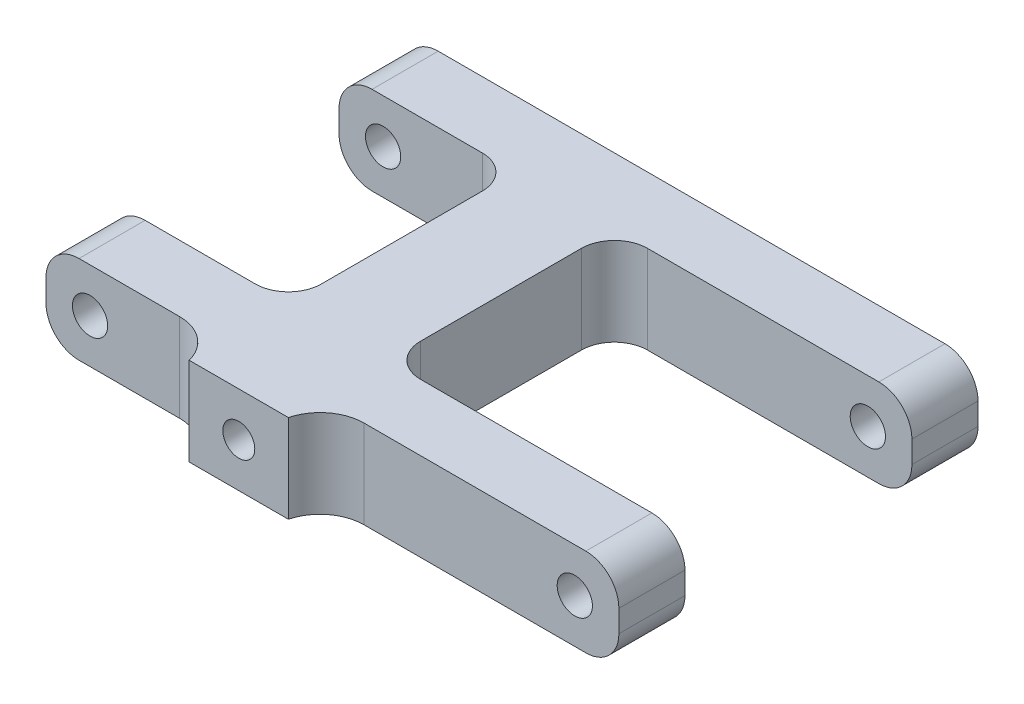
ISO-10303-21;
HEADER;
FILE_DESCRIPTION(('STEP AP214'),'2;1');
FILE_NAME('part.step','',(''),(''),'','','');
FILE_SCHEMA(('AUTOMOTIVE_DESIGN { 1 0 10303 214 1 1 1 1 }'));
ENDSEC;
DATA;
#1=APPLICATION_CONTEXT('core data for automotive mechanical design processes');
#2=APPLICATION_PROTOCOL_DEFINITION('international standard','automotive_design',2000,#1);
#3=PRODUCT_CONTEXT('',#1,'mechanical');
#4=PRODUCT('Part','Part','',(#3));
#5=PRODUCT_RELATED_PRODUCT_CATEGORY('part','',(#4));
#6=PRODUCT_DEFINITION_FORMATION('','',#4);
#7=PRODUCT_DEFINITION_CONTEXT('part definition',#1,'design');
#8=PRODUCT_DEFINITION('design','',#6,#7);
#9=PRODUCT_DEFINITION_SHAPE('','',#8);
#10=(LENGTH_UNIT() NAMED_UNIT(*) SI_UNIT(.MILLI.,.METRE.));
#11=(NAMED_UNIT(*) PLANE_ANGLE_UNIT() SI_UNIT($,.RADIAN.));
#12=(NAMED_UNIT(*) SI_UNIT($,.STERADIAN.) SOLID_ANGLE_UNIT());
#13=UNCERTAINTY_MEASURE_WITH_UNIT(LENGTH_MEASURE(1.E-05),#10,'distance_accuracy_value','');
#14=(GEOMETRIC_REPRESENTATION_CONTEXT(3) GLOBAL_UNCERTAINTY_ASSIGNED_CONTEXT((#13)) GLOBAL_UNIT_ASSIGNED_CONTEXT((#10,
#11,#12)) REPRESENTATION_CONTEXT('',''));
#15=CARTESIAN_POINT('',(0.,0.,0.));
#16=DIRECTION('',(0.,0.,1.));
#17=DIRECTION('',(1.,0.,0.));
#18=AXIS2_PLACEMENT_3D('',#15,#16,#17);
#19=CARTESIAN_POINT('',(0.,8.,32.6));
#20=DIRECTION('',(0.,0.,-1.));
#21=DIRECTION('',(-1.,0.,0.));
#22=AXIS2_PLACEMENT_3D('',#19,#20,#21);
#23=PLANE('',#22);
#24=CARTESIAN_POINT('',(4.,4.,32.6));
#25=DIRECTION('',(0.,0.,1.));
#26=DIRECTION('',(1.,0.,0.));
#27=AXIS2_PLACEMENT_3D('',#24,#25,#26);
#28=CIRCLE('',#27,1.6);
#29=CARTESIAN_POINT('',(5.6,4.,32.6));
#30=VERTEX_POINT('',#29);
#31=EDGE_CURVE('E254',#30,#30,#28,.T.);
#32=ORIENTED_EDGE('',*,*,#31,.F.);
#33=EDGE_LOOP('',(#32));
#34=FACE_BOUND('',#33,.T.);
#35=DIRECTION('',(1.,0.,0.));
#36=VECTOR('',#35,1.);
#37=CARTESIAN_POINT('',(0.,0.,32.6));
#38=LINE('',#37,#36);
#39=CARTESIAN_POINT('',(3.,0.,32.6));
#40=VERTEX_POINT('',#39);
#41=CARTESIAN_POINT('',(12.1270166537926,0.,32.6));
#42=VERTEX_POINT('',#41);
#43=EDGE_CURVE('E312',#40,#42,#38,.T.);
#44=ORIENTED_EDGE('',*,*,#43,.T.);
#45=DIRECTION('',(0.,-1.,0.));
#46=VECTOR('',#45,1.);
#47=CARTESIAN_POINT('',(12.1270166537926,8.,32.6));
#48=LINE('',#47,#46);
#49=CARTESIAN_POINT('',(12.1270166537926,8.,32.6));
#50=VERTEX_POINT('',#49);
#51=EDGE_CURVE('E54',#42,#50,#48,.F.);
#52=ORIENTED_EDGE('',*,*,#51,.T.);
#53=DIRECTION('',(1.,0.,0.));
#54=VECTOR('',#53,1.);
#55=CARTESIAN_POINT('',(0.,8.,32.6));
#56=LINE('',#55,#54);
#57=CARTESIAN_POINT('',(3.,8.,32.6));
#58=VERTEX_POINT('',#57);
#59=EDGE_CURVE('E305',#58,#50,#56,.T.);
#60=ORIENTED_EDGE('',*,*,#59,.F.);
#61=CARTESIAN_POINT('',(3.,5.,32.6));
#62=DIRECTION('',(0.,0.,-1.));
#63=DIRECTION('',(-1.,0.,0.));
#64=AXIS2_PLACEMENT_3D('',#61,#62,#63);
#65=CIRCLE('',#64,3.);
#66=CARTESIAN_POINT('',(0.,5.,32.6));
#67=VERTEX_POINT('',#66);
#68=EDGE_CURVE('E342',#58,#67,#65,.F.);
#69=ORIENTED_EDGE('',*,*,#68,.T.);
#70=DIRECTION('',(0.,-1.,0.));
#71=VECTOR('',#70,1.);
#72=CARTESIAN_POINT('',(0.,8.,32.6));
#73=LINE('',#72,#71);
#74=CARTESIAN_POINT('',(0.,3.,32.6));
#75=VERTEX_POINT('',#74);
#76=EDGE_CURVE('E325',#67,#75,#73,.T.);
#77=ORIENTED_EDGE('',*,*,#76,.T.);
#78=CARTESIAN_POINT('',(3.,3.,32.6));
#79=DIRECTION('',(0.,0.,-1.));
#80=DIRECTION('',(-1.,0.,0.));
#81=AXIS2_PLACEMENT_3D('',#78,#79,#80);
#82=CIRCLE('',#81,3.);
#83=EDGE_CURVE('E344',#75,#40,#82,.F.);
#84=ORIENTED_EDGE('',*,*,#83,.T.);
#85=EDGE_LOOP('',(#44,#52,#60,#69,#77,#84));
#86=FACE_BOUND('',#85,.T.);
#87=ADVANCED_FACE('F33',(#34,#86),#23,.F.);
#88=CARTESIAN_POINT('',(48.,4.,32.6));
#89=DIRECTION('',(0.,0.,1.));
#90=DIRECTION('',(1.,0.,0.));
#91=AXIS2_PLACEMENT_3D('',#88,#89,#90);
#92=CIRCLE('',#91,1.59999999999999);
#93=CARTESIAN_POINT('',(49.6,4.,32.6));
#94=VERTEX_POINT('',#93);
#95=EDGE_CURVE('E244',#94,#94,#92,.T.);
#96=ORIENTED_EDGE('',*,*,#95,.F.);
#97=EDGE_LOOP('',(#96));
#98=FACE_BOUND('',#97,.T.);
#99=CARTESIAN_POINT('',(28.8729833462074,8.,32.6));
#100=VERTEX_POINT('',#99);
#101=CARTESIAN_POINT('',(49.,8.,32.6));
#102=VERTEX_POINT('',#101);
#103=EDGE_CURVE('E308',#100,#102,#56,.T.);
#104=ORIENTED_EDGE('',*,*,#103,.F.);
#105=DIRECTION('',(0.,1.,0.));
#106=VECTOR('',#105,1.);
#107=CARTESIAN_POINT('',(28.8729833462074,8.,32.6));
#108=LINE('',#107,#106);
#109=CARTESIAN_POINT('',(28.8729833462074,0.,32.6));
#110=VERTEX_POINT('',#109);
#111=EDGE_CURVE('E447',#100,#110,#108,.F.);
#112=ORIENTED_EDGE('',*,*,#111,.T.);
#113=CARTESIAN_POINT('',(49.,0.,32.6));
#114=VERTEX_POINT('',#113);
#115=EDGE_CURVE('E299',#110,#114,#38,.T.);
#116=ORIENTED_EDGE('',*,*,#115,.T.);
#117=CARTESIAN_POINT('',(49.,3.,32.6));
#118=DIRECTION('',(0.,0.,-1.));
#119=DIRECTION('',(-1.,0.,0.));
#120=AXIS2_PLACEMENT_3D('',#117,#118,#119);
#121=CIRCLE('',#120,3.);
#122=CARTESIAN_POINT('',(52.,3.,32.6));
#123=VERTEX_POINT('',#122);
#124=EDGE_CURVE('E340',#114,#123,#121,.F.);
#125=ORIENTED_EDGE('',*,*,#124,.T.);
#126=DIRECTION('',(0.,-1.,0.));
#127=VECTOR('',#126,1.);
#128=CARTESIAN_POINT('',(52.,8.,32.6));
#129=LINE('',#128,#127);
#130=CARTESIAN_POINT('',(52.,5.,32.6));
#131=VERTEX_POINT('',#130);
#132=EDGE_CURVE('E322',#131,#123,#129,.T.);
#133=ORIENTED_EDGE('',*,*,#132,.F.);
#134=CARTESIAN_POINT('',(49.,5.,32.6));
#135=DIRECTION('',(0.,0.,-1.));
#136=DIRECTION('',(-1.,0.,0.));
#137=AXIS2_PLACEMENT_3D('',#134,#135,#136);
#138=CIRCLE('',#137,3.);
#139=EDGE_CURVE('E337',#131,#102,#138,.F.);
#140=ORIENTED_EDGE('',*,*,#139,.T.);
#141=EDGE_LOOP('',(#104,#112,#116,#125,#133,#140));
#142=FACE_BOUND('',#141,.T.);
#143=ADVANCED_FACE('F460',(#98,#142),#23,.F.);
#144=CARTESIAN_POINT('',(0.,8.,0.));
#145=DIRECTION('',(1.,0.,0.));
#146=DIRECTION('',(0.,0.,-1.));
#147=AXIS2_PLACEMENT_3D('',#144,#145,#146);
#148=PLANE('',#147);
#149=DIRECTION('',(0.,-1.,0.));
#150=VECTOR('',#149,1.);
#151=CARTESIAN_POINT('',(0.,8.,0.));
#152=LINE('',#151,#150);
#153=CARTESIAN_POINT('',(0.,5.,0.));
#154=VERTEX_POINT('',#153);
#155=CARTESIAN_POINT('',(0.,3.,0.));
#156=VERTEX_POINT('',#155);
#157=EDGE_CURVE('E311',#154,#156,#152,.T.);
#158=ORIENTED_EDGE('',*,*,#157,.T.);
#159=DIRECTION('',(0.,0.,1.));
#160=VECTOR('',#159,1.);
#161=CARTESIAN_POINT('',(0.,3.,0.));
#162=LINE('',#161,#160);
#163=CARTESIAN_POINT('',(0.,3.,6.));
#164=VERTEX_POINT('',#163);
#165=EDGE_CURVE('E376',#156,#164,#162,.T.);
#166=ORIENTED_EDGE('',*,*,#165,.T.);
#167=DIRECTION('',(0.,-1.,0.));
#168=VECTOR('',#167,1.);
#169=CARTESIAN_POINT('',(0.,8.,6.));
#170=LINE('',#169,#168);
#171=CARTESIAN_POINT('',(0.,5.,6.));
#172=VERTEX_POINT('',#171);
#173=EDGE_CURVE('E264',#172,#164,#170,.T.);
#174=ORIENTED_EDGE('',*,*,#173,.F.);
#175=DIRECTION('',(0.,0.,1.));
#176=VECTOR('',#175,1.);
#177=CARTESIAN_POINT('',(0.,5.,0.));
#178=LINE('',#177,#176);
#179=EDGE_CURVE('E374',#172,#154,#178,.F.);
#180=ORIENTED_EDGE('',*,*,#179,.T.);
#181=EDGE_LOOP('',(#158,#166,#174,#180));
#182=FACE_BOUND('',#181,.T.);
#183=ADVANCED_FACE('F481',(#182),#148,.F.);
#184=CARTESIAN_POINT('',(52.,8.,0.));
#185=DIRECTION('',(-1.,0.,0.));
#186=DIRECTION('',(0.,0.,1.));
#187=AXIS2_PLACEMENT_3D('',#184,#185,#186);
#188=PLANE('',#187);
#189=ORIENTED_EDGE('',*,*,#132,.T.);
#190=DIRECTION('',(0.,0.,-1.));
#191=VECTOR('',#190,1.);
#192=CARTESIAN_POINT('',(52.,3.,0.));
#193=LINE('',#192,#191);
#194=CARTESIAN_POINT('',(52.,3.,26.6));
#195=VERTEX_POINT('',#194);
#196=EDGE_CURVE('E404',#123,#195,#193,.T.);
#197=ORIENTED_EDGE('',*,*,#196,.T.);
#198=DIRECTION('',(0.,-1.,0.));
#199=VECTOR('',#198,1.);
#200=CARTESIAN_POINT('',(52.,8.,26.6));
#201=LINE('',#200,#199);
#202=CARTESIAN_POINT('',(52.,5.,26.6));
#203=VERTEX_POINT('',#202);
#204=EDGE_CURVE('E279',#203,#195,#201,.T.);
#205=ORIENTED_EDGE('',*,*,#204,.F.);
#206=DIRECTION('',(0.,0.,-1.));
#207=VECTOR('',#206,1.);
#208=CARTESIAN_POINT('',(52.,5.,32.6));
#209=LINE('',#208,#207);
#210=EDGE_CURVE('E402',#203,#131,#209,.F.);
#211=ORIENTED_EDGE('',*,*,#210,.T.);
#212=EDGE_LOOP('',(#189,#197,#205,#211));
#213=FACE_BOUND('',#212,.T.);
#214=ADVANCED_FACE('F491',(#213),#188,.F.);
#215=DIRECTION('',(0.,1.,0.));
#216=VECTOR('',#215,1.);
#217=CARTESIAN_POINT('',(0.,8.,26.6));
#218=LINE('',#217,#216);
#219=CARTESIAN_POINT('',(0.,3.,26.6));
#220=VERTEX_POINT('',#219);
#221=CARTESIAN_POINT('',(0.,5.,26.6));
#222=VERTEX_POINT('',#221);
#223=EDGE_CURVE('E269',#220,#222,#218,.T.);
#224=ORIENTED_EDGE('',*,*,#223,.F.);
#225=DIRECTION('',(0.,0.,1.));
#226=VECTOR('',#225,1.);
#227=CARTESIAN_POINT('',(0.,3.,0.));
#228=LINE('',#227,#226);
#229=EDGE_CURVE('E334',#220,#75,#228,.T.);
#230=ORIENTED_EDGE('',*,*,#229,.T.);
#231=ORIENTED_EDGE('',*,*,#76,.F.);
#232=DIRECTION('',(0.,0.,1.));
#233=VECTOR('',#232,1.);
#234=CARTESIAN_POINT('',(0.,5.,26.6));
#235=LINE('',#234,#233);
#236=EDGE_CURVE('E328',#67,#222,#235,.F.);
#237=ORIENTED_EDGE('',*,*,#236,.T.);
#238=EDGE_LOOP('',(#224,#230,#231,#237));
#239=FACE_BOUND('',#238,.T.);
#240=ADVANCED_FACE('F488',(#239),#148,.F.);
#241=DIRECTION('',(0.,-1.,0.));
#242=VECTOR('',#241,1.);
#243=CARTESIAN_POINT('',(52.,8.,0.));
#244=LINE('',#243,#242);
#245=CARTESIAN_POINT('',(52.,5.,0.));
#246=VERTEX_POINT('',#245);
#247=CARTESIAN_POINT('',(52.,3.,0.));
#248=VERTEX_POINT('',#247);
#249=EDGE_CURVE('E319',#246,#248,#244,.T.);
#250=ORIENTED_EDGE('',*,*,#249,.F.);
#251=DIRECTION('',(0.,0.,-1.));
#252=VECTOR('',#251,1.);
#253=CARTESIAN_POINT('',(52.,5.,5.99999999999999));
#254=LINE('',#253,#252);
#255=CARTESIAN_POINT('',(52.,5.,5.99999999999999));
#256=VERTEX_POINT('',#255);
#257=EDGE_CURVE('E395',#246,#256,#254,.F.);
#258=ORIENTED_EDGE('',*,*,#257,.T.);
#259=DIRECTION('',(0.,1.,0.));
#260=VECTOR('',#259,1.);
#261=CARTESIAN_POINT('',(52.,8.,5.99999999999999));
#262=LINE('',#261,#260);
#263=CARTESIAN_POINT('',(52.,3.,5.99999999999999));
#264=VERTEX_POINT('',#263);
#265=EDGE_CURVE('E289',#264,#256,#262,.T.);
#266=ORIENTED_EDGE('',*,*,#265,.F.);
#267=DIRECTION('',(0.,0.,-1.));
#268=VECTOR('',#267,1.);
#269=CARTESIAN_POINT('',(52.,3.,0.));
#270=LINE('',#269,#268);
#271=EDGE_CURVE('E392',#264,#248,#270,.T.);
#272=ORIENTED_EDGE('',*,*,#271,.T.);
#273=EDGE_LOOP('',(#250,#258,#266,#272));
#274=FACE_BOUND('',#273,.T.);
#275=ADVANCED_FACE('F486',(#274),#188,.F.);
#276=CARTESIAN_POINT('',(0.,8.,0.));
#277=DIRECTION('',(0.,0.,1.));
#278=DIRECTION('',(1.,0.,0.));
#279=AXIS2_PLACEMENT_3D('',#276,#277,#278);
#280=PLANE('',#279);
#281=CARTESIAN_POINT('',(48.,4.,0.));
#282=DIRECTION('',(0.,0.,1.));
#283=DIRECTION('',(1.,0.,0.));
#284=AXIS2_PLACEMENT_3D('',#281,#282,#283);
#285=CIRCLE('',#284,1.59999999999999);
#286=CARTESIAN_POINT('',(49.6,4.,0.));
#287=VERTEX_POINT('',#286);
#288=EDGE_CURVE('E245',#287,#287,#285,.T.);
#289=ORIENTED_EDGE('',*,*,#288,.T.);
#290=EDGE_LOOP('',(#289));
#291=FACE_BOUND('',#290,.T.);
#292=CARTESIAN_POINT('',(4.,4.,0.));
#293=DIRECTION('',(0.,0.,1.));
#294=DIRECTION('',(1.,0.,0.));
#295=AXIS2_PLACEMENT_3D('',#292,#293,#294);
#296=CIRCLE('',#295,1.6);
#297=CARTESIAN_POINT('',(5.6,4.,0.));
#298=VERTEX_POINT('',#297);
#299=EDGE_CURVE('E255',#298,#298,#296,.T.);
#300=ORIENTED_EDGE('',*,*,#299,.T.);
#301=EDGE_LOOP('',(#300));
#302=FACE_BOUND('',#301,.T.);
#303=DIRECTION('',(-1.,0.,0.));
#304=VECTOR('',#303,1.);
#305=CARTESIAN_POINT('',(0.,0.,0.));
#306=LINE('',#305,#304);
#307=CARTESIAN_POINT('',(49.,0.,0.));
#308=VERTEX_POINT('',#307);
#309=CARTESIAN_POINT('',(3.,0.,0.));
#310=VERTEX_POINT('',#309);
#311=EDGE_CURVE('E314',#308,#310,#306,.T.);
#312=ORIENTED_EDGE('',*,*,#311,.T.);
#313=CARTESIAN_POINT('',(3.,3.,0.));
#314=DIRECTION('',(0.,0.,1.));
#315=DIRECTION('',(1.,0.,0.));
#316=AXIS2_PLACEMENT_3D('',#313,#314,#315);
#317=CIRCLE('',#316,3.);
#318=EDGE_CURVE('E390',#310,#156,#317,.F.);
#319=ORIENTED_EDGE('',*,*,#318,.T.);
#320=ORIENTED_EDGE('',*,*,#157,.F.);
#321=CARTESIAN_POINT('',(3.,5.,0.));
#322=DIRECTION('',(0.,0.,1.));
#323=DIRECTION('',(1.,0.,0.));
#324=AXIS2_PLACEMENT_3D('',#321,#322,#323);
#325=CIRCLE('',#324,3.);
#326=CARTESIAN_POINT('',(3.,8.,0.));
#327=VERTEX_POINT('',#326);
#328=EDGE_CURVE('E388',#154,#327,#325,.F.);
#329=ORIENTED_EDGE('',*,*,#328,.T.);
#330=DIRECTION('',(-1.,0.,0.));
#331=VECTOR('',#330,1.);
#332=CARTESIAN_POINT('',(0.,8.,0.));
#333=LINE('',#332,#331);
#334=CARTESIAN_POINT('',(49.,8.,0.));
#335=VERTEX_POINT('',#334);
#336=EDGE_CURVE('E307',#335,#327,#333,.T.);
#337=ORIENTED_EDGE('',*,*,#336,.F.);
#338=CARTESIAN_POINT('',(49.,5.,0.));
#339=DIRECTION('',(0.,0.,1.));
#340=DIRECTION('',(1.,0.,0.));
#341=AXIS2_PLACEMENT_3D('',#338,#339,#340);
#342=CIRCLE('',#341,3.);
#343=EDGE_CURVE('E386',#335,#246,#342,.F.);
#344=ORIENTED_EDGE('',*,*,#343,.T.);
#345=ORIENTED_EDGE('',*,*,#249,.T.);
#346=CARTESIAN_POINT('',(49.,3.,0.));
#347=DIRECTION('',(0.,0.,1.));
#348=DIRECTION('',(1.,0.,0.));
#349=AXIS2_PLACEMENT_3D('',#346,#347,#348);
#350=CIRCLE('',#349,3.);
#351=EDGE_CURVE('E384',#248,#308,#350,.F.);
#352=ORIENTED_EDGE('',*,*,#351,.T.);
#353=EDGE_LOOP('',(#312,#319,#320,#329,#337,#344,#345,#352));
#354=FACE_BOUND('',#353,.T.);
#355=ADVANCED_FACE('F577',(#291,#302,#354),#280,.F.);
#356=CARTESIAN_POINT('',(0.,8.,0.));
#357=DIRECTION('',(0.,1.,0.));
#358=DIRECTION('',(0.,0.,1.));
#359=AXIS2_PLACEMENT_3D('',#356,#357,#358);
#360=PLANE('',#359);
#361=DIRECTION('',(0.,0.,-1.));
#362=VECTOR('',#361,1.);
#363=CARTESIAN_POINT('',(16.,8.,6.));
#364=LINE('',#363,#362);
#365=CARTESIAN_POINT('',(16.,8.,23.6));
#366=VERTEX_POINT('',#365);
#367=CARTESIAN_POINT('',(16.,8.,9.));
#368=VERTEX_POINT('',#367);
#369=EDGE_CURVE('E268',#366,#368,#364,.T.);
#370=ORIENTED_EDGE('',*,*,#369,.F.);
#371=CARTESIAN_POINT('',(13.,8.,23.6));
#372=DIRECTION('',(0.,1.,0.));
#373=DIRECTION('',(0.,0.,1.));
#374=AXIS2_PLACEMENT_3D('',#371,#372,#373);
#375=CIRCLE('',#374,3.);
#376=CARTESIAN_POINT('',(13.,8.,26.6));
#377=VERTEX_POINT('',#376);
#378=EDGE_CURVE('E440',#366,#377,#375,.F.);
#379=ORIENTED_EDGE('',*,*,#378,.T.);
#380=DIRECTION('',(-1.,0.,0.));
#381=VECTOR('',#380,1.);
#382=CARTESIAN_POINT('',(16.,8.,26.6));
#383=LINE('',#382,#381);
#384=CARTESIAN_POINT('',(3.,8.,26.6));
#385=VERTEX_POINT('',#384);
#386=EDGE_CURVE('E280',#377,#385,#383,.T.);
#387=ORIENTED_EDGE('',*,*,#386,.T.);
#388=DIRECTION('',(0.,0.,1.));
#389=VECTOR('',#388,1.);
#390=CARTESIAN_POINT('',(3.,8.,32.6));
#391=LINE('',#390,#389);
#392=EDGE_CURVE('E371',#385,#58,#391,.T.);
#393=ORIENTED_EDGE('',*,*,#392,.T.);
#394=ORIENTED_EDGE('',*,*,#59,.T.);
#395=CARTESIAN_POINT('',(12.1270166537926,8.,36.6));
#396=DIRECTION('',(0.,1.,0.));
#397=DIRECTION('',(0.,0.,1.));
#398=AXIS2_PLACEMENT_3D('',#395,#396,#397);
#399=CIRCLE('',#398,4.);
#400=CARTESIAN_POINT('',(16.,8.,35.6));
#401=VERTEX_POINT('',#400);
#402=EDGE_CURVE('E11',#50,#401,#399,.F.);
#403=ORIENTED_EDGE('',*,*,#402,.T.);
#404=DIRECTION('',(-1.,0.,0.));
#405=VECTOR('',#404,1.);
#406=CARTESIAN_POINT('',(16.,8.,35.6));
#407=LINE('',#406,#405);
#408=CARTESIAN_POINT('',(25.,8.,35.6));
#409=VERTEX_POINT('',#408);
#410=EDGE_CURVE('E234',#409,#401,#407,.T.);
#411=ORIENTED_EDGE('',*,*,#410,.F.);
#412=CARTESIAN_POINT('',(28.8729833462074,8.,36.6));
#413=DIRECTION('',(0.,1.,0.));
#414=DIRECTION('',(0.,0.,1.));
#415=AXIS2_PLACEMENT_3D('',#412,#413,#414);
#416=CIRCLE('',#415,4.);
#417=EDGE_CURVE('E451',#409,#100,#416,.F.);
#418=ORIENTED_EDGE('',*,*,#417,.T.);
#419=ORIENTED_EDGE('',*,*,#103,.T.);
#420=DIRECTION('',(0.,0.,-1.));
#421=VECTOR('',#420,1.);
#422=CARTESIAN_POINT('',(49.,8.,26.6));
#423=LINE('',#422,#421);
#424=CARTESIAN_POINT('',(49.,8.,26.6));
#425=VERTEX_POINT('',#424);
#426=EDGE_CURVE('E362',#102,#425,#423,.T.);
#427=ORIENTED_EDGE('',*,*,#426,.T.);
#428=DIRECTION('',(1.,0.,0.));
#429=VECTOR('',#428,1.);
#430=CARTESIAN_POINT('',(25.,8.,26.6));
#431=LINE('',#430,#429);
#432=CARTESIAN_POINT('',(28.,8.,26.6));
#433=VERTEX_POINT('',#432);
#434=EDGE_CURVE('E297',#433,#425,#431,.T.);
#435=ORIENTED_EDGE('',*,*,#434,.F.);
#436=CARTESIAN_POINT('',(28.,8.,23.6));
#437=DIRECTION('',(0.,1.,0.));
#438=DIRECTION('',(0.,0.,1.));
#439=AXIS2_PLACEMENT_3D('',#436,#437,#438);
#440=CIRCLE('',#439,3.);
#441=CARTESIAN_POINT('',(25.,8.,23.6));
#442=VERTEX_POINT('',#441);
#443=EDGE_CURVE('E434',#433,#442,#440,.F.);
#444=ORIENTED_EDGE('',*,*,#443,.T.);
#445=DIRECTION('',(0.,0.,1.));
#446=VECTOR('',#445,1.);
#447=CARTESIAN_POINT('',(25.,8.,26.6));
#448=LINE('',#447,#446);
#449=CARTESIAN_POINT('',(25.,8.,8.99999999999999));
#450=VERTEX_POINT('',#449);
#451=EDGE_CURVE('E288',#450,#442,#448,.T.);
#452=ORIENTED_EDGE('',*,*,#451,.F.);
#453=CARTESIAN_POINT('',(28.,8.,8.99999999999999));
#454=DIRECTION('',(0.,1.,0.));
#455=DIRECTION('',(0.,0.,1.));
#456=AXIS2_PLACEMENT_3D('',#453,#454,#455);
#457=CIRCLE('',#456,3.);
#458=CARTESIAN_POINT('',(28.,8.,5.99999999999999));
#459=VERTEX_POINT('',#458);
#460=EDGE_CURVE('E436',#450,#459,#457,.F.);
#461=ORIENTED_EDGE('',*,*,#460,.T.);
#462=DIRECTION('',(1.,0.,0.));
#463=VECTOR('',#462,1.);
#464=CARTESIAN_POINT('',(25.,8.,5.99999999999999));
#465=LINE('',#464,#463);
#466=CARTESIAN_POINT('',(49.,8.,5.99999999999999));
#467=VERTEX_POINT('',#466);
#468=EDGE_CURVE('E300',#459,#467,#465,.T.);
#469=ORIENTED_EDGE('',*,*,#468,.T.);
#470=DIRECTION('',(0.,0.,-1.));
#471=VECTOR('',#470,1.);
#472=CARTESIAN_POINT('',(49.,8.,0.));
#473=LINE('',#472,#471);
#474=EDGE_CURVE('E365',#467,#335,#473,.T.);
#475=ORIENTED_EDGE('',*,*,#474,.T.);
#476=ORIENTED_EDGE('',*,*,#336,.T.);
#477=DIRECTION('',(0.,0.,1.));
#478=VECTOR('',#477,1.);
#479=CARTESIAN_POINT('',(3.,8.,6.));
#480=LINE('',#479,#478);
#481=CARTESIAN_POINT('',(3.,8.,6.));
#482=VERTEX_POINT('',#481);
#483=EDGE_CURVE('E368',#327,#482,#480,.T.);
#484=ORIENTED_EDGE('',*,*,#483,.T.);
#485=DIRECTION('',(-1.,0.,0.));
#486=VECTOR('',#485,1.);
#487=CARTESIAN_POINT('',(16.,8.,6.));
#488=LINE('',#487,#486);
#489=CARTESIAN_POINT('',(13.,8.,6.));
#490=VERTEX_POINT('',#489);
#491=EDGE_CURVE('E277',#490,#482,#488,.T.);
#492=ORIENTED_EDGE('',*,*,#491,.F.);
#493=CARTESIAN_POINT('',(13.,8.,9.));
#494=DIRECTION('',(0.,1.,0.));
#495=DIRECTION('',(0.,0.,1.));
#496=AXIS2_PLACEMENT_3D('',#493,#494,#495);
#497=CIRCLE('',#496,3.);
#498=EDGE_CURVE('E446',#490,#368,#497,.F.);
#499=ORIENTED_EDGE('',*,*,#498,.T.);
#500=EDGE_LOOP('',(#370,#379,#387,#393,#394,#403,#411,#418,#419,#427,#435,#444,#452,#461,#469,
#475,#476,#484,#492,#499));
#501=FACE_BOUND('',#500,.T.);
#502=ADVANCED_FACE('F456',(#501),#360,.T.);
#503=CARTESIAN_POINT('',(0.,0.,0.));
#504=DIRECTION('',(0.,1.,0.));
#505=DIRECTION('',(0.,0.,1.));
#506=AXIS2_PLACEMENT_3D('',#503,#504,#505);
#507=PLANE('',#506);
#508=ORIENTED_EDGE('',*,*,#43,.F.);
#509=DIRECTION('',(0.,0.,1.));
#510=VECTOR('',#509,1.);
#511=CARTESIAN_POINT('',(3.,0.,0.));
#512=LINE('',#511,#510);
#513=CARTESIAN_POINT('',(3.,0.,26.6));
#514=VERTEX_POINT('',#513);
#515=EDGE_CURVE('E354',#40,#514,#512,.F.);
#516=ORIENTED_EDGE('',*,*,#515,.T.);
#517=DIRECTION('',(-1.,0.,0.));
#518=VECTOR('',#517,1.);
#519=CARTESIAN_POINT('',(16.,0.,26.6));
#520=LINE('',#519,#518);
#521=CARTESIAN_POINT('',(13.,0.,26.6));
#522=VERTEX_POINT('',#521);
#523=EDGE_CURVE('E282',#522,#514,#520,.T.);
#524=ORIENTED_EDGE('',*,*,#523,.F.);
#525=CARTESIAN_POINT('',(13.,0.,23.6));
#526=DIRECTION('',(0.,1.,0.));
#527=DIRECTION('',(0.,0.,1.));
#528=AXIS2_PLACEMENT_3D('',#525,#526,#527);
#529=CIRCLE('',#528,3.);
#530=CARTESIAN_POINT('',(16.,0.,23.6));
#531=VERTEX_POINT('',#530);
#532=EDGE_CURVE('E442',#522,#531,#529,.T.);
#533=ORIENTED_EDGE('',*,*,#532,.T.);
#534=DIRECTION('',(0.,0.,1.));
#535=VECTOR('',#534,1.);
#536=CARTESIAN_POINT('',(16.,0.,6.));
#537=LINE('',#536,#535);
#538=CARTESIAN_POINT('',(16.,0.,9.));
#539=VERTEX_POINT('',#538);
#540=EDGE_CURVE('E265',#539,#531,#537,.T.);
#541=ORIENTED_EDGE('',*,*,#540,.F.);
#542=CARTESIAN_POINT('',(13.,0.,9.));
#543=DIRECTION('',(0.,1.,0.));
#544=DIRECTION('',(0.,0.,1.));
#545=AXIS2_PLACEMENT_3D('',#542,#543,#544);
#546=CIRCLE('',#545,3.);
#547=CARTESIAN_POINT('',(13.,0.,6.));
#548=VERTEX_POINT('',#547);
#549=EDGE_CURVE('E444',#539,#548,#546,.T.);
#550=ORIENTED_EDGE('',*,*,#549,.T.);
#551=DIRECTION('',(-1.,0.,0.));
#552=VECTOR('',#551,1.);
#553=CARTESIAN_POINT('',(16.,0.,6.));
#554=LINE('',#553,#552);
#555=CARTESIAN_POINT('',(3.,0.,6.));
#556=VERTEX_POINT('',#555);
#557=EDGE_CURVE('E272',#548,#556,#554,.T.);
#558=ORIENTED_EDGE('',*,*,#557,.T.);
#559=DIRECTION('',(0.,0.,1.));
#560=VECTOR('',#559,1.);
#561=CARTESIAN_POINT('',(3.,0.,0.));
#562=LINE('',#561,#560);
#563=EDGE_CURVE('E352',#556,#310,#562,.F.);
#564=ORIENTED_EDGE('',*,*,#563,.T.);
#565=ORIENTED_EDGE('',*,*,#311,.F.);
#566=DIRECTION('',(0.,0.,-1.));
#567=VECTOR('',#566,1.);
#568=CARTESIAN_POINT('',(49.,0.,0.));
#569=LINE('',#568,#567);
#570=CARTESIAN_POINT('',(49.,0.,5.99999999999999));
#571=VERTEX_POINT('',#570);
#572=EDGE_CURVE('E349',#308,#571,#569,.F.);
#573=ORIENTED_EDGE('',*,*,#572,.T.);
#574=DIRECTION('',(1.,0.,0.));
#575=VECTOR('',#574,1.);
#576=CARTESIAN_POINT('',(25.,0.,5.99999999999999));
#577=LINE('',#576,#575);
#578=CARTESIAN_POINT('',(28.,0.,5.99999999999999));
#579=VERTEX_POINT('',#578);
#580=EDGE_CURVE('E302',#579,#571,#577,.T.);
#581=ORIENTED_EDGE('',*,*,#580,.F.);
#582=CARTESIAN_POINT('',(28.,0.,8.99999999999999));
#583=DIRECTION('',(0.,1.,0.));
#584=DIRECTION('',(0.,0.,1.));
#585=AXIS2_PLACEMENT_3D('',#582,#583,#584);
#586=CIRCLE('',#585,3.);
#587=CARTESIAN_POINT('',(25.,0.,8.99999999999999));
#588=VERTEX_POINT('',#587);
#589=EDGE_CURVE('E438',#579,#588,#586,.T.);
#590=ORIENTED_EDGE('',*,*,#589,.T.);
#591=DIRECTION('',(0.,0.,-1.));
#592=VECTOR('',#591,1.);
#593=CARTESIAN_POINT('',(25.,0.,26.6));
#594=LINE('',#593,#592);
#595=CARTESIAN_POINT('',(25.,0.,23.6));
#596=VERTEX_POINT('',#595);
#597=EDGE_CURVE('E285',#596,#588,#594,.T.);
#598=ORIENTED_EDGE('',*,*,#597,.F.);
#599=CARTESIAN_POINT('',(28.,0.,23.6));
#600=DIRECTION('',(0.,1.,0.));
#601=DIRECTION('',(0.,0.,1.));
#602=AXIS2_PLACEMENT_3D('',#599,#600,#601);
#603=CIRCLE('',#602,3.);
#604=CARTESIAN_POINT('',(28.,0.,26.6));
#605=VERTEX_POINT('',#604);
#606=EDGE_CURVE('E432',#596,#605,#603,.T.);
#607=ORIENTED_EDGE('',*,*,#606,.T.);
#608=DIRECTION('',(1.,0.,0.));
#609=VECTOR('',#608,1.);
#610=CARTESIAN_POINT('',(25.,0.,26.6));
#611=LINE('',#610,#609);
#612=CARTESIAN_POINT('',(49.,0.,26.6));
#613=VERTEX_POINT('',#612);
#614=EDGE_CURVE('E292',#605,#613,#611,.T.);
#615=ORIENTED_EDGE('',*,*,#614,.T.);
#616=DIRECTION('',(0.,0.,-1.));
#617=VECTOR('',#616,1.);
#618=CARTESIAN_POINT('',(49.,0.,0.));
#619=LINE('',#618,#617);
#620=EDGE_CURVE('E346',#613,#114,#619,.F.);
#621=ORIENTED_EDGE('',*,*,#620,.T.);
#622=ORIENTED_EDGE('',*,*,#115,.F.);
#623=CARTESIAN_POINT('',(28.8729833462074,0.,36.6));
#624=DIRECTION('',(0.,1.,0.));
#625=DIRECTION('',(0.,0.,1.));
#626=AXIS2_PLACEMENT_3D('',#623,#624,#625);
#627=CIRCLE('',#626,4.);
#628=CARTESIAN_POINT('',(25.,0.,35.6));
#629=VERTEX_POINT('',#628);
#630=EDGE_CURVE('E220',#110,#629,#627,.T.);
#631=ORIENTED_EDGE('',*,*,#630,.T.);
#632=DIRECTION('',(1.,0.,0.));
#633=VECTOR('',#632,1.);
#634=CARTESIAN_POINT('',(16.,0.,35.6));
#635=LINE('',#634,#633);
#636=CARTESIAN_POINT('',(16.,0.,35.6));
#637=VERTEX_POINT('',#636);
#638=EDGE_CURVE('E222',#637,#629,#635,.T.);
#639=ORIENTED_EDGE('',*,*,#638,.F.);
#640=CARTESIAN_POINT('',(12.1270166537926,0.,36.6));
#641=DIRECTION('',(0.,1.,0.));
#642=DIRECTION('',(0.,0.,1.));
#643=AXIS2_PLACEMENT_3D('',#640,#641,#642);
#644=CIRCLE('',#643,4.);
#645=EDGE_CURVE('E41',#637,#42,#644,.T.);
#646=ORIENTED_EDGE('',*,*,#645,.T.);
#647=EDGE_LOOP('',(#508,#516,#524,#533,#541,#550,#558,#564,#565,#573,#581,#590,#598,#607,#615,
#621,#622,#631,#639,#646));
#648=FACE_BOUND('',#647,.T.);
#649=ADVANCED_FACE('F223',(#648),#507,.F.);
#650=CARTESIAN_POINT('',(25.,8.,26.6));
#651=DIRECTION('',(0.,0.,1.));
#652=DIRECTION('',(1.,0.,0.));
#653=AXIS2_PLACEMENT_3D('',#650,#651,#652);
#654=PLANE('',#653);
#655=CARTESIAN_POINT('',(48.,4.,26.6));
#656=DIRECTION('',(0.,0.,1.));
#657=DIRECTION('',(1.,0.,0.));
#658=AXIS2_PLACEMENT_3D('',#655,#656,#657);
#659=CIRCLE('',#658,1.59999999999999);
#660=CARTESIAN_POINT('',(49.6,4.,26.6));
#661=VERTEX_POINT('',#660);
#662=EDGE_CURVE('E251',#661,#661,#659,.T.);
#663=ORIENTED_EDGE('',*,*,#662,.T.);
#664=EDGE_LOOP('',(#663));
#665=FACE_BOUND('',#664,.T.);
#666=ORIENTED_EDGE('',*,*,#614,.F.);
#667=DIRECTION('',(0.,-1.,0.));
#668=VECTOR('',#667,1.);
#669=CARTESIAN_POINT('',(28.,8.,26.6));
#670=LINE('',#669,#668);
#671=EDGE_CURVE('E418',#605,#433,#670,.F.);
#672=ORIENTED_EDGE('',*,*,#671,.T.);
#673=ORIENTED_EDGE('',*,*,#434,.T.);
#674=CARTESIAN_POINT('',(49.,5.,26.6));
#675=DIRECTION('',(0.,0.,1.));
#676=DIRECTION('',(1.,0.,0.));
#677=AXIS2_PLACEMENT_3D('',#674,#675,#676);
#678=CIRCLE('',#677,3.);
#679=EDGE_CURVE('E407',#425,#203,#678,.F.);
#680=ORIENTED_EDGE('',*,*,#679,.T.);
#681=ORIENTED_EDGE('',*,*,#204,.T.);
#682=CARTESIAN_POINT('',(49.,3.,26.6));
#683=DIRECTION('',(0.,0.,1.));
#684=DIRECTION('',(1.,0.,0.));
#685=AXIS2_PLACEMENT_3D('',#682,#683,#684);
#686=CIRCLE('',#685,3.);
#687=EDGE_CURVE('E409',#195,#613,#686,.F.);
#688=ORIENTED_EDGE('',*,*,#687,.T.);
#689=EDGE_LOOP('',(#666,#672,#673,#680,#681,#688));
#690=FACE_BOUND('',#689,.T.);
#691=ADVANCED_FACE('F615',(#665,#690),#654,.F.);
#692=CARTESIAN_POINT('',(25.,8.,5.99999999999999));
#693=DIRECTION('',(0.,0.,-1.));
#694=DIRECTION('',(0.,1.,0.));
#695=AXIS2_PLACEMENT_3D('',#692,#693,#694);
#696=PLANE('',#695);
#697=CARTESIAN_POINT('',(48.,4.,5.99999999999999));
#698=DIRECTION('',(0.,0.,-1.));
#699=DIRECTION('',(0.,1.,0.));
#700=AXIS2_PLACEMENT_3D('',#697,#698,#699);
#701=CIRCLE('',#700,1.59999999999999);
#702=CARTESIAN_POINT('',(48.,5.59999999999999,5.99999999999999));
#703=VERTEX_POINT('',#702);
#704=EDGE_CURVE('E248',#703,#703,#701,.T.);
#705=ORIENTED_EDGE('',*,*,#704,.T.);
#706=EDGE_LOOP('',(#705));
#707=FACE_BOUND('',#706,.T.);
#708=ORIENTED_EDGE('',*,*,#468,.F.);
#709=DIRECTION('',(0.,1.,0.));
#710=VECTOR('',#709,1.);
#711=CARTESIAN_POINT('',(28.,8.,5.99999999999999));
#712=LINE('',#711,#710);
#713=EDGE_CURVE('E420',#459,#579,#712,.F.);
#714=ORIENTED_EDGE('',*,*,#713,.T.);
#715=ORIENTED_EDGE('',*,*,#580,.T.);
#716=CARTESIAN_POINT('',(49.,3.,5.99999999999999));
#717=DIRECTION('',(0.,0.,-1.));
#718=DIRECTION('',(0.,1.,0.));
#719=AXIS2_PLACEMENT_3D('',#716,#717,#718);
#720=CIRCLE('',#719,3.);
#721=EDGE_CURVE('E397',#571,#264,#720,.F.);
#722=ORIENTED_EDGE('',*,*,#721,.T.);
#723=ORIENTED_EDGE('',*,*,#265,.T.);
#724=CARTESIAN_POINT('',(49.,5.,5.99999999999999));
#725=DIRECTION('',(0.,0.,-1.));
#726=DIRECTION('',(0.,1.,0.));
#727=AXIS2_PLACEMENT_3D('',#724,#725,#726);
#728=CIRCLE('',#727,3.);
#729=EDGE_CURVE('E399',#256,#467,#728,.F.);
#730=ORIENTED_EDGE('',*,*,#729,.T.);
#731=EDGE_LOOP('',(#708,#714,#715,#722,#723,#730));
#732=FACE_BOUND('',#731,.T.);
#733=ADVANCED_FACE('F588',(#707,#732),#696,.F.);
#734=CARTESIAN_POINT('',(25.,0.,0.));
#735=DIRECTION('',(1.,0.,0.));
#736=DIRECTION('',(0.,0.,-1.));
#737=AXIS2_PLACEMENT_3D('',#734,#735,#736);
#738=PLANE('',#737);
#739=ORIENTED_EDGE('',*,*,#451,.T.);
#740=DIRECTION('',(0.,-1.,0.));
#741=VECTOR('',#740,1.);
#742=CARTESIAN_POINT('',(25.,0.,23.6));
#743=LINE('',#742,#741);
#744=EDGE_CURVE('E415',#442,#596,#743,.T.);
#745=ORIENTED_EDGE('',*,*,#744,.T.);
#746=ORIENTED_EDGE('',*,*,#597,.T.);
#747=DIRECTION('',(0.,1.,0.));
#748=VECTOR('',#747,1.);
#749=CARTESIAN_POINT('',(25.,0.,8.99999999999999));
#750=LINE('',#749,#748);
#751=EDGE_CURVE('E412',#588,#450,#750,.T.);
#752=ORIENTED_EDGE('',*,*,#751,.T.);
#753=EDGE_LOOP('',(#739,#745,#746,#752));
#754=FACE_BOUND('',#753,.T.);
#755=ADVANCED_FACE('F622',(#754),#738,.T.);
#756=CARTESIAN_POINT('',(16.,8.,6.));
#757=DIRECTION('',(0.,0.,-1.));
#758=DIRECTION('',(-1.,0.,0.));
#759=AXIS2_PLACEMENT_3D('',#756,#757,#758);
#760=PLANE('',#759);
#761=CARTESIAN_POINT('',(4.,4.,6.));
#762=DIRECTION('',(0.,0.,-1.));
#763=DIRECTION('',(-1.,0.,0.));
#764=AXIS2_PLACEMENT_3D('',#761,#762,#763);
#765=CIRCLE('',#764,1.6);
#766=CARTESIAN_POINT('',(2.4,4.,6.));
#767=VERTEX_POINT('',#766);
#768=EDGE_CURVE('E261',#767,#767,#765,.T.);
#769=ORIENTED_EDGE('',*,*,#768,.T.);
#770=EDGE_LOOP('',(#769));
#771=FACE_BOUND('',#770,.T.);
#772=ORIENTED_EDGE('',*,*,#557,.F.);
#773=DIRECTION('',(0.,-1.,0.));
#774=VECTOR('',#773,1.);
#775=CARTESIAN_POINT('',(13.,8.,6.));
#776=LINE('',#775,#774);
#777=EDGE_CURVE('E430',#548,#490,#776,.F.);
#778=ORIENTED_EDGE('',*,*,#777,.T.);
#779=ORIENTED_EDGE('',*,*,#491,.T.);
#780=CARTESIAN_POINT('',(3.,5.,6.));
#781=DIRECTION('',(0.,0.,-1.));
#782=DIRECTION('',(-1.,0.,0.));
#783=AXIS2_PLACEMENT_3D('',#780,#781,#782);
#784=CIRCLE('',#783,3.);
#785=EDGE_CURVE('E379',#482,#172,#784,.F.);
#786=ORIENTED_EDGE('',*,*,#785,.T.);
#787=ORIENTED_EDGE('',*,*,#173,.T.);
#788=CARTESIAN_POINT('',(3.,3.,6.));
#789=DIRECTION('',(0.,0.,-1.));
#790=DIRECTION('',(-1.,0.,0.));
#791=AXIS2_PLACEMENT_3D('',#788,#789,#790);
#792=CIRCLE('',#791,3.);
#793=EDGE_CURVE('E381',#164,#556,#792,.F.);
#794=ORIENTED_EDGE('',*,*,#793,.T.);
#795=EDGE_LOOP('',(#772,#778,#779,#786,#787,#794));
#796=FACE_BOUND('',#795,.T.);
#797=ADVANCED_FACE('F569',(#771,#796),#760,.F.);
#798=CARTESIAN_POINT('',(16.,8.,26.6));
#799=DIRECTION('',(0.,0.,1.));
#800=DIRECTION('',(1.,0.,0.));
#801=AXIS2_PLACEMENT_3D('',#798,#799,#800);
#802=PLANE('',#801);
#803=CARTESIAN_POINT('',(4.,4.,26.6));
#804=DIRECTION('',(0.,0.,1.));
#805=DIRECTION('',(1.,0.,0.));
#806=AXIS2_PLACEMENT_3D('',#803,#804,#805);
#807=CIRCLE('',#806,1.6);
#808=CARTESIAN_POINT('',(5.6,4.,26.6));
#809=VERTEX_POINT('',#808);
#810=EDGE_CURVE('E258',#809,#809,#807,.T.);
#811=ORIENTED_EDGE('',*,*,#810,.T.);
#812=EDGE_LOOP('',(#811));
#813=FACE_BOUND('',#812,.T.);
#814=ORIENTED_EDGE('',*,*,#386,.F.);
#815=DIRECTION('',(0.,1.,0.));
#816=VECTOR('',#815,1.);
#817=CARTESIAN_POINT('',(13.,8.,26.6));
#818=LINE('',#817,#816);
#819=EDGE_CURVE('E428',#377,#522,#818,.F.);
#820=ORIENTED_EDGE('',*,*,#819,.T.);
#821=ORIENTED_EDGE('',*,*,#523,.T.);
#822=CARTESIAN_POINT('',(3.,3.,26.6));
#823=DIRECTION('',(0.,0.,1.));
#824=DIRECTION('',(1.,0.,0.));
#825=AXIS2_PLACEMENT_3D('',#822,#823,#824);
#826=CIRCLE('',#825,3.);
#827=EDGE_CURVE('E360',#514,#220,#826,.F.);
#828=ORIENTED_EDGE('',*,*,#827,.T.);
#829=ORIENTED_EDGE('',*,*,#223,.T.);
#830=CARTESIAN_POINT('',(3.,5.,26.6));
#831=DIRECTION('',(0.,0.,1.));
#832=DIRECTION('',(1.,0.,0.));
#833=AXIS2_PLACEMENT_3D('',#830,#831,#832);
#834=CIRCLE('',#833,3.);
#835=EDGE_CURVE('E357',#222,#385,#834,.F.);
#836=ORIENTED_EDGE('',*,*,#835,.T.);
#837=EDGE_LOOP('',(#814,#820,#821,#828,#829,#836));
#838=FACE_BOUND('',#837,.T.);
#839=ADVANCED_FACE('F557',(#813,#838),#802,.F.);
#840=CARTESIAN_POINT('',(16.,0.,0.));
#841=DIRECTION('',(-1.,0.,0.));
#842=DIRECTION('',(0.,0.,1.));
#843=AXIS2_PLACEMENT_3D('',#840,#841,#842);
#844=PLANE('',#843);
#845=ORIENTED_EDGE('',*,*,#540,.T.);
#846=DIRECTION('',(0.,1.,0.));
#847=VECTOR('',#846,1.);
#848=CARTESIAN_POINT('',(16.,0.,23.6));
#849=LINE('',#848,#847);
#850=EDGE_CURVE('E425',#531,#366,#849,.T.);
#851=ORIENTED_EDGE('',*,*,#850,.T.);
#852=ORIENTED_EDGE('',*,*,#369,.T.);
#853=DIRECTION('',(0.,-1.,0.));
#854=VECTOR('',#853,1.);
#855=CARTESIAN_POINT('',(16.,0.,9.));
#856=LINE('',#855,#854);
#857=EDGE_CURVE('E422',#368,#539,#856,.T.);
#858=ORIENTED_EDGE('',*,*,#857,.T.);
#859=EDGE_LOOP('',(#845,#851,#852,#858));
#860=FACE_BOUND('',#859,.T.);
#861=ADVANCED_FACE('F550',(#860),#844,.T.);
#862=CARTESIAN_POINT('',(4.,4.,0.));
#863=DIRECTION('',(0.,0.,1.));
#864=DIRECTION('',(1.,0.,0.));
#865=AXIS2_PLACEMENT_3D('',#862,#863,#864);
#866=CYLINDRICAL_SURFACE('',#865,1.6);
#867=ORIENTED_EDGE('',*,*,#31,.T.);
#868=EDGE_LOOP('',(#867));
#869=FACE_BOUND('',#868,.T.);
#870=ORIENTED_EDGE('',*,*,#810,.F.);
#871=EDGE_LOOP('',(#870));
#872=FACE_BOUND('',#871,.T.);
#873=ADVANCED_FACE('F635',(#869,#872),#866,.F.);
#874=ORIENTED_EDGE('',*,*,#299,.F.);
#875=EDGE_LOOP('',(#874));
#876=FACE_BOUND('',#875,.T.);
#877=ORIENTED_EDGE('',*,*,#768,.F.);
#878=EDGE_LOOP('',(#877));
#879=FACE_BOUND('',#878,.T.);
#880=ADVANCED_FACE('F636',(#876,#879),#866,.F.);
#881=CARTESIAN_POINT('',(48.,4.,0.));
#882=DIRECTION('',(0.,0.,1.));
#883=DIRECTION('',(1.,0.,0.));
#884=AXIS2_PLACEMENT_3D('',#881,#882,#883);
#885=CYLINDRICAL_SURFACE('',#884,1.59999999999999);
#886=ORIENTED_EDGE('',*,*,#288,.F.);
#887=EDGE_LOOP('',(#886));
#888=FACE_BOUND('',#887,.T.);
#889=ORIENTED_EDGE('',*,*,#704,.F.);
#890=EDGE_LOOP('',(#889));
#891=FACE_BOUND('',#890,.T.);
#892=ADVANCED_FACE('F639',(#888,#891),#885,.F.);
#893=ORIENTED_EDGE('',*,*,#95,.T.);
#894=EDGE_LOOP('',(#893));
#895=FACE_BOUND('',#894,.T.);
#896=ORIENTED_EDGE('',*,*,#662,.F.);
#897=EDGE_LOOP('',(#896));
#898=FACE_BOUND('',#897,.T.);
#899=ADVANCED_FACE('F497',(#895,#898),#885,.F.);
#900=CARTESIAN_POINT('',(3.,3.,0.));
#901=DIRECTION('',(0.,0.,1.));
#902=DIRECTION('',(1.,0.,0.));
#903=AXIS2_PLACEMENT_3D('',#900,#901,#902);
#904=CYLINDRICAL_SURFACE('',#903,3.);
#905=ORIENTED_EDGE('',*,*,#827,.F.);
#906=ORIENTED_EDGE('',*,*,#515,.F.);
#907=ORIENTED_EDGE('',*,*,#83,.F.);
#908=ORIENTED_EDGE('',*,*,#229,.F.);
#909=EDGE_LOOP('',(#905,#906,#907,#908));
#910=FACE_BOUND('',#909,.T.);
#911=ADVANCED_FACE('F493',(#910),#904,.T.);
#912=CARTESIAN_POINT('',(3.,5.,0.));
#913=DIRECTION('',(0.,0.,-1.));
#914=DIRECTION('',(-1.,0.,0.));
#915=AXIS2_PLACEMENT_3D('',#912,#913,#914);
#916=CYLINDRICAL_SURFACE('',#915,3.);
#917=ORIENTED_EDGE('',*,*,#835,.F.);
#918=ORIENTED_EDGE('',*,*,#236,.F.);
#919=ORIENTED_EDGE('',*,*,#68,.F.);
#920=ORIENTED_EDGE('',*,*,#392,.F.);
#921=EDGE_LOOP('',(#917,#918,#919,#920));
#922=FACE_BOUND('',#921,.T.);
#923=ADVANCED_FACE('F496',(#922),#916,.T.);
#924=CARTESIAN_POINT('',(3.,3.,0.));
#925=DIRECTION('',(0.,0.,1.));
#926=DIRECTION('',(1.,0.,0.));
#927=AXIS2_PLACEMENT_3D('',#924,#925,#926);
#928=CYLINDRICAL_SURFACE('',#927,3.);
#929=ORIENTED_EDGE('',*,*,#318,.F.);
#930=ORIENTED_EDGE('',*,*,#563,.F.);
#931=ORIENTED_EDGE('',*,*,#793,.F.);
#932=ORIENTED_EDGE('',*,*,#165,.F.);
#933=EDGE_LOOP('',(#929,#930,#931,#932));
#934=FACE_BOUND('',#933,.T.);
#935=ADVANCED_FACE('F501',(#934),#928,.T.);
#936=CARTESIAN_POINT('',(3.,5.,0.));
#937=DIRECTION('',(0.,0.,-1.));
#938=DIRECTION('',(-1.,0.,0.));
#939=AXIS2_PLACEMENT_3D('',#936,#937,#938);
#940=CYLINDRICAL_SURFACE('',#939,3.);
#941=ORIENTED_EDGE('',*,*,#328,.F.);
#942=ORIENTED_EDGE('',*,*,#179,.F.);
#943=ORIENTED_EDGE('',*,*,#785,.F.);
#944=ORIENTED_EDGE('',*,*,#483,.F.);
#945=EDGE_LOOP('',(#941,#942,#943,#944));
#946=FACE_BOUND('',#945,.T.);
#947=ADVANCED_FACE('F505',(#946),#940,.T.);
#948=CARTESIAN_POINT('',(49.,5.,0.));
#949=DIRECTION('',(0.,0.,1.));
#950=DIRECTION('',(1.,0.,0.));
#951=AXIS2_PLACEMENT_3D('',#948,#949,#950);
#952=CYLINDRICAL_SURFACE('',#951,3.);
#953=ORIENTED_EDGE('',*,*,#729,.F.);
#954=ORIENTED_EDGE('',*,*,#257,.F.);
#955=ORIENTED_EDGE('',*,*,#343,.F.);
#956=ORIENTED_EDGE('',*,*,#474,.F.);
#957=EDGE_LOOP('',(#953,#954,#955,#956));
#958=FACE_BOUND('',#957,.T.);
#959=ADVANCED_FACE('F509',(#958),#952,.T.);
#960=CARTESIAN_POINT('',(49.,3.,0.));
#961=DIRECTION('',(0.,0.,-1.));
#962=DIRECTION('',(-1.,0.,0.));
#963=AXIS2_PLACEMENT_3D('',#960,#961,#962);
#964=CYLINDRICAL_SURFACE('',#963,3.);
#965=ORIENTED_EDGE('',*,*,#721,.F.);
#966=ORIENTED_EDGE('',*,*,#572,.F.);
#967=ORIENTED_EDGE('',*,*,#351,.F.);
#968=ORIENTED_EDGE('',*,*,#271,.F.);
#969=EDGE_LOOP('',(#965,#966,#967,#968));
#970=FACE_BOUND('',#969,.T.);
#971=ADVANCED_FACE('F513',(#970),#964,.T.);
#972=CARTESIAN_POINT('',(49.,3.,0.));
#973=DIRECTION('',(0.,0.,-1.));
#974=DIRECTION('',(-1.,0.,0.));
#975=AXIS2_PLACEMENT_3D('',#972,#973,#974);
#976=CYLINDRICAL_SURFACE('',#975,3.);
#977=ORIENTED_EDGE('',*,*,#124,.F.);
#978=ORIENTED_EDGE('',*,*,#620,.F.);
#979=ORIENTED_EDGE('',*,*,#687,.F.);
#980=ORIENTED_EDGE('',*,*,#196,.F.);
#981=EDGE_LOOP('',(#977,#978,#979,#980));
#982=FACE_BOUND('',#981,.T.);
#983=ADVANCED_FACE('F517',(#982),#976,.T.);
#984=CARTESIAN_POINT('',(49.,5.,0.));
#985=DIRECTION('',(0.,0.,1.));
#986=DIRECTION('',(1.,0.,0.));
#987=AXIS2_PLACEMENT_3D('',#984,#985,#986);
#988=CYLINDRICAL_SURFACE('',#987,3.);
#989=ORIENTED_EDGE('',*,*,#139,.F.);
#990=ORIENTED_EDGE('',*,*,#210,.F.);
#991=ORIENTED_EDGE('',*,*,#679,.F.);
#992=ORIENTED_EDGE('',*,*,#426,.F.);
#993=EDGE_LOOP('',(#989,#990,#991,#992));
#994=FACE_BOUND('',#993,.T.);
#995=ADVANCED_FACE('F521',(#994),#988,.T.);
#996=CARTESIAN_POINT('',(28.,0.,23.6));
#997=DIRECTION('',(0.,-1.,0.));
#998=DIRECTION('',(0.,0.,-1.));
#999=AXIS2_PLACEMENT_3D('',#996,#997,#998);
#1000=CYLINDRICAL_SURFACE('',#999,3.);
#1001=ORIENTED_EDGE('',*,*,#443,.F.);
#1002=ORIENTED_EDGE('',*,*,#671,.F.);
#1003=ORIENTED_EDGE('',*,*,#606,.F.);
#1004=ORIENTED_EDGE('',*,*,#744,.F.);
#1005=EDGE_LOOP('',(#1001,#1002,#1003,#1004));
#1006=FACE_BOUND('',#1005,.T.);
#1007=ADVANCED_FACE('F525',(#1006),#1000,.F.);
#1008=CARTESIAN_POINT('',(28.,0.,8.99999999999999));
#1009=DIRECTION('',(0.,1.,0.));
#1010=DIRECTION('',(0.,0.,1.));
#1011=AXIS2_PLACEMENT_3D('',#1008,#1009,#1010);
#1012=CYLINDRICAL_SURFACE('',#1011,3.);
#1013=ORIENTED_EDGE('',*,*,#589,.F.);
#1014=ORIENTED_EDGE('',*,*,#713,.F.);
#1015=ORIENTED_EDGE('',*,*,#460,.F.);
#1016=ORIENTED_EDGE('',*,*,#751,.F.);
#1017=EDGE_LOOP('',(#1013,#1014,#1015,#1016));
#1018=FACE_BOUND('',#1017,.T.);
#1019=ADVANCED_FACE('F529',(#1018),#1012,.F.);
#1020=CARTESIAN_POINT('',(13.,0.,23.6));
#1021=DIRECTION('',(0.,1.,0.));
#1022=DIRECTION('',(0.,0.,1.));
#1023=AXIS2_PLACEMENT_3D('',#1020,#1021,#1022);
#1024=CYLINDRICAL_SURFACE('',#1023,3.);
#1025=ORIENTED_EDGE('',*,*,#532,.F.);
#1026=ORIENTED_EDGE('',*,*,#819,.F.);
#1027=ORIENTED_EDGE('',*,*,#378,.F.);
#1028=ORIENTED_EDGE('',*,*,#850,.F.);
#1029=EDGE_LOOP('',(#1025,#1026,#1027,#1028));
#1030=FACE_BOUND('',#1029,.T.);
#1031=ADVANCED_FACE('F533',(#1030),#1024,.F.);
#1032=CARTESIAN_POINT('',(13.,0.,9.));
#1033=DIRECTION('',(0.,-1.,0.));
#1034=DIRECTION('',(0.,0.,-1.));
#1035=AXIS2_PLACEMENT_3D('',#1032,#1033,#1034);
#1036=CYLINDRICAL_SURFACE('',#1035,3.);
#1037=ORIENTED_EDGE('',*,*,#498,.F.);
#1038=ORIENTED_EDGE('',*,*,#777,.F.);
#1039=ORIENTED_EDGE('',*,*,#549,.F.);
#1040=ORIENTED_EDGE('',*,*,#857,.F.);
#1041=EDGE_LOOP('',(#1037,#1038,#1039,#1040));
#1042=FACE_BOUND('',#1041,.T.);
#1043=ADVANCED_FACE('F536',(#1042),#1036,.F.);
#1044=CARTESIAN_POINT('',(0.,0.,35.6));
#1045=DIRECTION('',(0.,0.,1.));
#1046=DIRECTION('',(1.,0.,0.));
#1047=AXIS2_PLACEMENT_3D('',#1044,#1045,#1046);
#1048=PLANE('',#1047);
#1049=CARTESIAN_POINT('',(20.5,4.,35.6));
#1050=DIRECTION('',(0.,0.,1.));
#1051=DIRECTION('',(1.,0.,0.));
#1052=AXIS2_PLACEMENT_3D('',#1049,#1050,#1051);
#1053=CIRCLE('',#1052,1.45);
#1054=CARTESIAN_POINT('',(21.95,4.,35.6));
#1055=VERTEX_POINT('',#1054);
#1056=EDGE_CURVE('E235',#1055,#1055,#1053,.F.);
#1057=ORIENTED_EDGE('',*,*,#1056,.T.);
#1058=EDGE_LOOP('',(#1057));
#1059=FACE_BOUND('',#1058,.T.);
#1060=DIRECTION('',(0.,-1.,0.));
#1061=VECTOR('',#1060,1.);
#1062=CARTESIAN_POINT('',(16.,8.,35.6));
#1063=LINE('',#1062,#1061);
#1064=EDGE_CURVE('E219',#401,#637,#1063,.T.);
#1065=ORIENTED_EDGE('',*,*,#1064,.T.);
#1066=ORIENTED_EDGE('',*,*,#638,.T.);
#1067=DIRECTION('',(0.,1.,0.));
#1068=VECTOR('',#1067,1.);
#1069=CARTESIAN_POINT('',(25.,8.,35.6));
#1070=LINE('',#1069,#1068);
#1071=EDGE_CURVE('E229',#629,#409,#1070,.T.);
#1072=ORIENTED_EDGE('',*,*,#1071,.T.);
#1073=ORIENTED_EDGE('',*,*,#410,.T.);
#1074=EDGE_LOOP('',(#1065,#1066,#1072,#1073));
#1075=FACE_BOUND('',#1074,.T.);
#1076=ADVANCED_FACE('F232',(#1059,#1075),#1048,.T.);
#1077=CARTESIAN_POINT('',(20.5,4.,36.6));
#1078=DIRECTION('',(0.,0.,-1.));
#1079=DIRECTION('',(-1.,0.,0.));
#1080=AXIS2_PLACEMENT_3D('',#1077,#1078,#1079);
#1081=CYLINDRICAL_SURFACE('',#1080,1.45);
#1082=ORIENTED_EDGE('',*,*,#1056,.F.);
#1083=EDGE_LOOP('',(#1082));
#1084=FACE_BOUND('',#1083,.T.);
#1085=CARTESIAN_POINT('',(20.5,4.,17.6));
#1086=DIRECTION('',(0.,0.,1.));
#1087=DIRECTION('',(1.,0.,0.));
#1088=AXIS2_PLACEMENT_3D('',#1085,#1086,#1087);
#1089=CIRCLE('',#1088,1.45);
#1090=CARTESIAN_POINT('',(21.95,4.,17.6));
#1091=VERTEX_POINT('',#1090);
#1092=EDGE_CURVE('E238',#1091,#1091,#1089,.T.);
#1093=ORIENTED_EDGE('',*,*,#1092,.F.);
#1094=EDGE_LOOP('',(#1093));
#1095=FACE_BOUND('',#1094,.T.);
#1096=ADVANCED_FACE('F471',(#1084,#1095),#1081,.F.);
#1097=CARTESIAN_POINT('',(20.5,4.,17.6));
#1098=DIRECTION('',(0.,0.,1.));
#1099=DIRECTION('',(1.,0.,0.));
#1100=AXIS2_PLACEMENT_3D('',#1097,#1098,#1099);
#1101=PLANE('',#1100);
#1102=ORIENTED_EDGE('',*,*,#1092,.T.);
#1103=EDGE_LOOP('',(#1102));
#1104=FACE_BOUND('',#1103,.T.);
#1105=ADVANCED_FACE('F466',(#1104),#1101,.T.);
#1106=CARTESIAN_POINT('',(28.8729833462074,8.,36.6));
#1107=DIRECTION('',(0.,1.,0.));
#1108=DIRECTION('',(0.,0.,1.));
#1109=AXIS2_PLACEMENT_3D('',#1106,#1107,#1108);
#1110=CYLINDRICAL_SURFACE('',#1109,4.);
#1111=ORIENTED_EDGE('',*,*,#630,.F.);
#1112=ORIENTED_EDGE('',*,*,#111,.F.);
#1113=ORIENTED_EDGE('',*,*,#417,.F.);
#1114=ORIENTED_EDGE('',*,*,#1071,.F.);
#1115=EDGE_LOOP('',(#1111,#1112,#1113,#1114));
#1116=FACE_BOUND('',#1115,.T.);
#1117=ADVANCED_FACE('F464',(#1116),#1110,.F.);
#1118=CARTESIAN_POINT('',(12.1270166537926,8.,36.6));
#1119=DIRECTION('',(0.,-1.,0.));
#1120=DIRECTION('',(0.,0.,-1.));
#1121=AXIS2_PLACEMENT_3D('',#1118,#1119,#1120);
#1122=CYLINDRICAL_SURFACE('',#1121,4.);
#1123=ORIENTED_EDGE('',*,*,#402,.F.);
#1124=ORIENTED_EDGE('',*,*,#51,.F.);
#1125=ORIENTED_EDGE('',*,*,#645,.F.);
#1126=ORIENTED_EDGE('',*,*,#1064,.F.);
#1127=EDGE_LOOP('',(#1123,#1124,#1125,#1126));
#1128=FACE_BOUND('',#1127,.T.);
#1129=ADVANCED_FACE('F35',(#1128),#1122,.F.);
#1130=CLOSED_SHELL('',(#87,#143,#183,#214,#240,#275,#355,#502,#649,#691,#733,#755,#797,#839,
#861,#873,#880,#892,#899,#911,#923,#935,#947,#959,#971,#983,#995,#1007,#1019,#1031,#1043,#1076,
#1096,#1105,#1117,#1129));
#1131=MANIFOLD_SOLID_BREP('B2',#1130);
#1132=ADVANCED_BREP_SHAPE_REPRESENTATION('',(#18,#1131),#14);
#1133=SHAPE_DEFINITION_REPRESENTATION(#9,#1132);
ENDSEC;
END-ISO-10303-21;
